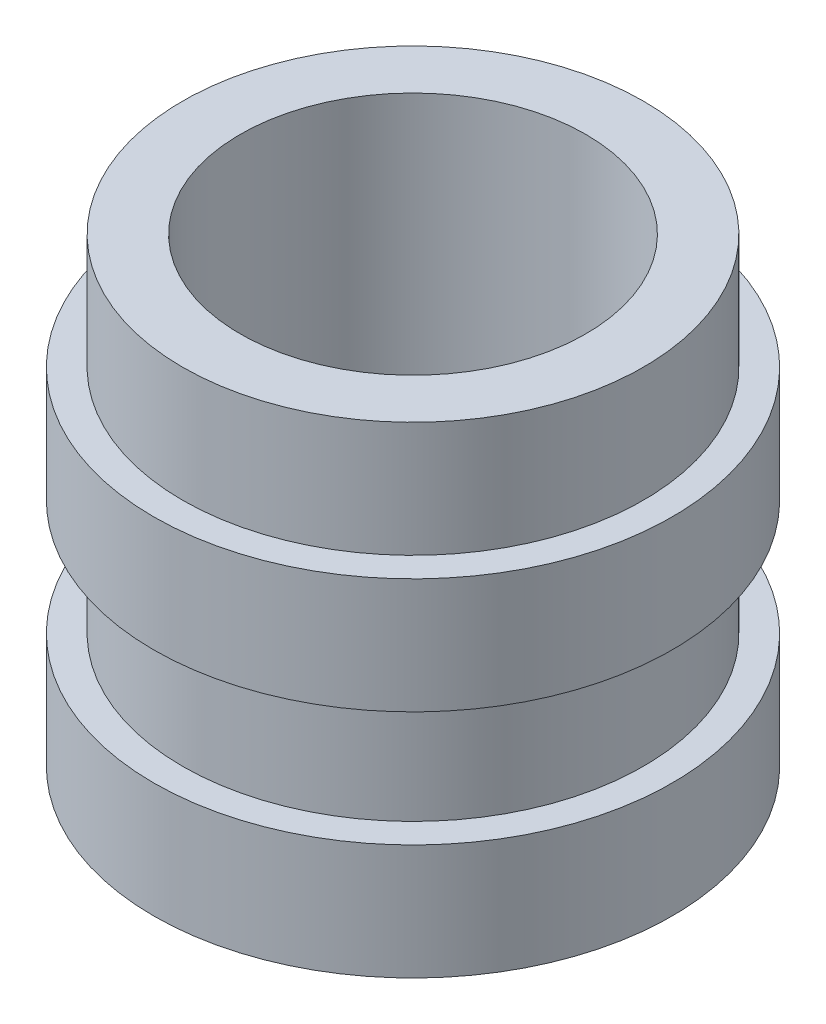
ISO-10303-21;
HEADER;
FILE_DESCRIPTION(('STEP AP214'),'2;1');
FILE_NAME('part.step','',(''),(''),'','','');
FILE_SCHEMA(('AUTOMOTIVE_DESIGN { 1 0 10303 214 1 1 1 1 }'));
ENDSEC;
DATA;
#1=APPLICATION_CONTEXT('core data for automotive mechanical design processes');
#2=APPLICATION_PROTOCOL_DEFINITION('international standard','automotive_design',2000,#1);
#3=PRODUCT_CONTEXT('',#1,'mechanical');
#4=PRODUCT('Part','Part','',(#3));
#5=PRODUCT_RELATED_PRODUCT_CATEGORY('part','',(#4));
#6=PRODUCT_DEFINITION_FORMATION('','',#4);
#7=PRODUCT_DEFINITION_CONTEXT('part definition',#1,'design');
#8=PRODUCT_DEFINITION('design','',#6,#7);
#9=PRODUCT_DEFINITION_SHAPE('','',#8);
#10=(LENGTH_UNIT() NAMED_UNIT(*) SI_UNIT(.MILLI.,.METRE.));
#11=(NAMED_UNIT(*) PLANE_ANGLE_UNIT() SI_UNIT($,.RADIAN.));
#12=(NAMED_UNIT(*) SI_UNIT($,.STERADIAN.) SOLID_ANGLE_UNIT());
#13=UNCERTAINTY_MEASURE_WITH_UNIT(LENGTH_MEASURE(1.E-05),#10,'distance_accuracy_value','');
#14=(GEOMETRIC_REPRESENTATION_CONTEXT(3) GLOBAL_UNCERTAINTY_ASSIGNED_CONTEXT((#13)) GLOBAL_UNIT_ASSIGNED_CONTEXT((#10,
#11,#12)) REPRESENTATION_CONTEXT('',''));
#15=CARTESIAN_POINT('',(0.,0.,0.));
#16=DIRECTION('',(0.,0.,1.));
#17=DIRECTION('',(1.,0.,0.));
#18=AXIS2_PLACEMENT_3D('',#15,#16,#17);
#19=CARTESIAN_POINT('',(0.,1.,0.));
#20=DIRECTION('',(0.,-1.,0.));
#21=DIRECTION('',(0.,0.,-1.));
#22=AXIS2_PLACEMENT_3D('',#19,#20,#21);
#23=CYLINDRICAL_SURFACE('',#22,2.);
#24=CARTESIAN_POINT('',(0.,1.,0.));
#25=DIRECTION('',(0.,1.,0.));
#26=DIRECTION('',(0.,0.,1.));
#27=AXIS2_PLACEMENT_3D('',#24,#25,#26);
#28=CIRCLE('',#27,2.);
#29=CARTESIAN_POINT('',(0.,1.,2.));
#30=VERTEX_POINT('',#29);
#31=EDGE_CURVE('E45',#30,#30,#28,.T.);
#32=ORIENTED_EDGE('',*,*,#31,.F.);
#33=EDGE_LOOP('',(#32));
#34=FACE_BOUND('',#33,.T.);
#35=CARTESIAN_POINT('',(0.,0.,0.));
#36=DIRECTION('',(0.,1.,0.));
#37=DIRECTION('',(0.,0.,1.));
#38=AXIS2_PLACEMENT_3D('',#35,#36,#37);
#39=CIRCLE('',#38,2.);
#40=CARTESIAN_POINT('',(0.,0.,2.));
#41=VERTEX_POINT('',#40);
#42=EDGE_CURVE('E40',#41,#41,#39,.T.);
#43=ORIENTED_EDGE('',*,*,#42,.T.);
#44=EDGE_LOOP('',(#43));
#45=FACE_BOUND('',#44,.T.);
#46=ADVANCED_FACE('F37',(#34,#45),#23,.T.);
#47=CARTESIAN_POINT('',(0.,1.,0.));
#48=DIRECTION('',(0.,1.,0.));
#49=DIRECTION('',(0.,0.,1.));
#50=AXIS2_PLACEMENT_3D('',#47,#48,#49);
#51=PLANE('',#50);
#52=CARTESIAN_POINT('',(0.,1.,0.));
#53=DIRECTION('',(0.,-1.,0.));
#54=DIRECTION('',(0.,0.,-1.));
#55=AXIS2_PLACEMENT_3D('',#52,#53,#54);
#56=CIRCLE('',#55,1.5);
#57=CARTESIAN_POINT('',(0.,1.,-1.5));
#58=VERTEX_POINT('',#57);
#59=EDGE_CURVE('E77',#58,#58,#56,.T.);
#60=ORIENTED_EDGE('',*,*,#59,.T.);
#61=EDGE_LOOP('',(#60));
#62=FACE_BOUND('',#61,.T.);
#63=ORIENTED_EDGE('',*,*,#31,.T.);
#64=EDGE_LOOP('',(#63));
#65=FACE_BOUND('',#64,.T.);
#66=ADVANCED_FACE('F87',(#62,#65),#51,.T.);
#67=CARTESIAN_POINT('',(0.,-1.,0.));
#68=DIRECTION('',(0.,1.,0.));
#69=DIRECTION('',(0.,0.,1.));
#70=AXIS2_PLACEMENT_3D('',#67,#68,#69);
#71=CYLINDRICAL_SURFACE('',#70,2.25);
#72=CARTESIAN_POINT('',(0.,-1.,0.));
#73=DIRECTION('',(0.,-1.,0.));
#74=DIRECTION('',(0.,0.,-1.));
#75=AXIS2_PLACEMENT_3D('',#72,#73,#74);
#76=CIRCLE('',#75,2.25);
#77=CARTESIAN_POINT('',(0.,-1.,-2.25));
#78=VERTEX_POINT('',#77);
#79=EDGE_CURVE('E55',#78,#78,#76,.T.);
#80=ORIENTED_EDGE('',*,*,#79,.F.);
#81=EDGE_LOOP('',(#80));
#82=FACE_BOUND('',#81,.T.);
#83=CARTESIAN_POINT('',(0.,0.,0.));
#84=DIRECTION('',(0.,-1.,0.));
#85=DIRECTION('',(0.,0.,-1.));
#86=AXIS2_PLACEMENT_3D('',#83,#84,#85);
#87=CIRCLE('',#86,2.25);
#88=CARTESIAN_POINT('',(0.,0.,-2.25));
#89=VERTEX_POINT('',#88);
#90=EDGE_CURVE('E59',#89,#89,#87,.T.);
#91=ORIENTED_EDGE('',*,*,#90,.T.);
#92=EDGE_LOOP('',(#91));
#93=FACE_BOUND('',#92,.T.);
#94=ADVANCED_FACE('F114',(#82,#93),#71,.T.);
#95=CARTESIAN_POINT('',(0.,-1.,0.));
#96=DIRECTION('',(0.,-1.,0.));
#97=DIRECTION('',(0.,0.,-1.));
#98=AXIS2_PLACEMENT_3D('',#95,#96,#97);
#99=PLANE('',#98);
#100=CARTESIAN_POINT('',(0.,-1.,0.));
#101=DIRECTION('',(0.,-1.,0.));
#102=DIRECTION('',(0.,0.,-1.));
#103=AXIS2_PLACEMENT_3D('',#100,#101,#102);
#104=CIRCLE('',#103,2.);
#105=CARTESIAN_POINT('',(0.,-1.,-2.));
#106=VERTEX_POINT('',#105);
#107=EDGE_CURVE('E10',#106,#106,#104,.T.);
#108=ORIENTED_EDGE('',*,*,#107,.F.);
#109=EDGE_LOOP('',(#108));
#110=FACE_BOUND('',#109,.T.);
#111=ORIENTED_EDGE('',*,*,#79,.T.);
#112=EDGE_LOOP('',(#111));
#113=FACE_BOUND('',#112,.T.);
#114=ADVANCED_FACE('F124',(#110,#113),#99,.T.);
#115=CARTESIAN_POINT('',(0.,0.,0.));
#116=DIRECTION('',(0.,-1.,0.));
#117=DIRECTION('',(0.,0.,-1.));
#118=AXIS2_PLACEMENT_3D('',#115,#116,#117);
#119=PLANE('',#118);
#120=ORIENTED_EDGE('',*,*,#42,.F.);
#121=EDGE_LOOP('',(#120));
#122=FACE_BOUND('',#121,.T.);
#123=ORIENTED_EDGE('',*,*,#90,.F.);
#124=EDGE_LOOP('',(#123));
#125=FACE_BOUND('',#124,.T.);
#126=ADVANCED_FACE('F121',(#122,#125),#119,.F.);
#127=CARTESIAN_POINT('',(0.,-2.,0.));
#128=DIRECTION('',(0.,1.,0.));
#129=DIRECTION('',(0.,0.,1.));
#130=AXIS2_PLACEMENT_3D('',#127,#128,#129);
#131=CYLINDRICAL_SURFACE('',#130,2.);
#132=CARTESIAN_POINT('',(0.,-2.,0.));
#133=DIRECTION('',(0.,-1.,0.));
#134=DIRECTION('',(0.,0.,-1.));
#135=AXIS2_PLACEMENT_3D('',#132,#133,#134);
#136=CIRCLE('',#135,2.);
#137=CARTESIAN_POINT('',(0.,-2.,-2.));
#138=VERTEX_POINT('',#137);
#139=EDGE_CURVE('E53',#138,#138,#136,.T.);
#140=ORIENTED_EDGE('',*,*,#139,.F.);
#141=EDGE_LOOP('',(#140));
#142=FACE_BOUND('',#141,.T.);
#143=ORIENTED_EDGE('',*,*,#107,.T.);
#144=EDGE_LOOP('',(#143));
#145=FACE_BOUND('',#144,.T.);
#146=ADVANCED_FACE('F106',(#142,#145),#131,.T.);
#147=CARTESIAN_POINT('',(0.,-3.,0.));
#148=DIRECTION('',(0.,1.,0.));
#149=DIRECTION('',(0.,0.,1.));
#150=AXIS2_PLACEMENT_3D('',#147,#148,#149);
#151=CYLINDRICAL_SURFACE('',#150,2.25);
#152=CARTESIAN_POINT('',(0.,-3.,0.));
#153=DIRECTION('',(0.,-1.,0.));
#154=DIRECTION('',(0.,0.,-1.));
#155=AXIS2_PLACEMENT_3D('',#152,#153,#154);
#156=CIRCLE('',#155,2.25);
#157=CARTESIAN_POINT('',(0.,-3.,-2.25));
#158=VERTEX_POINT('',#157);
#159=EDGE_CURVE('E66',#158,#158,#156,.T.);
#160=ORIENTED_EDGE('',*,*,#159,.F.);
#161=EDGE_LOOP('',(#160));
#162=FACE_BOUND('',#161,.T.);
#163=CARTESIAN_POINT('',(0.,-2.,0.));
#164=DIRECTION('',(0.,-1.,0.));
#165=DIRECTION('',(0.,0.,-1.));
#166=AXIS2_PLACEMENT_3D('',#163,#164,#165);
#167=CIRCLE('',#166,2.25);
#168=CARTESIAN_POINT('',(0.,-2.,-2.25));
#169=VERTEX_POINT('',#168);
#170=EDGE_CURVE('E71',#169,#169,#167,.T.);
#171=ORIENTED_EDGE('',*,*,#170,.T.);
#172=EDGE_LOOP('',(#171));
#173=FACE_BOUND('',#172,.T.);
#174=ADVANCED_FACE('F99',(#162,#173),#151,.T.);
#175=CARTESIAN_POINT('',(0.,-3.,0.));
#176=DIRECTION('',(0.,-1.,0.));
#177=DIRECTION('',(0.,0.,-1.));
#178=AXIS2_PLACEMENT_3D('',#175,#176,#177);
#179=PLANE('',#178);
#180=CARTESIAN_POINT('',(0.,-3.,0.));
#181=DIRECTION('',(0.,-1.,0.));
#182=DIRECTION('',(0.,0.,-1.));
#183=AXIS2_PLACEMENT_3D('',#180,#181,#182);
#184=CIRCLE('',#183,1.5);
#185=CARTESIAN_POINT('',(0.,-3.,-1.5));
#186=VERTEX_POINT('',#185);
#187=EDGE_CURVE('E79',#186,#186,#184,.T.);
#188=ORIENTED_EDGE('',*,*,#187,.F.);
#189=EDGE_LOOP('',(#188));
#190=FACE_BOUND('',#189,.T.);
#191=ORIENTED_EDGE('',*,*,#159,.T.);
#192=EDGE_LOOP('',(#191));
#193=FACE_BOUND('',#192,.T.);
#194=ADVANCED_FACE('F97',(#190,#193),#179,.T.);
#195=CARTESIAN_POINT('',(0.,-2.,0.));
#196=DIRECTION('',(0.,-1.,0.));
#197=DIRECTION('',(0.,0.,-1.));
#198=AXIS2_PLACEMENT_3D('',#195,#196,#197);
#199=PLANE('',#198);
#200=ORIENTED_EDGE('',*,*,#139,.T.);
#201=EDGE_LOOP('',(#200));
#202=FACE_BOUND('',#201,.T.);
#203=ORIENTED_EDGE('',*,*,#170,.F.);
#204=EDGE_LOOP('',(#203));
#205=FACE_BOUND('',#204,.T.);
#206=ADVANCED_FACE('F93',(#202,#205),#199,.F.);
#207=CARTESIAN_POINT('',(0.,1.,0.));
#208=DIRECTION('',(0.,-1.,0.));
#209=DIRECTION('',(0.,0.,-1.));
#210=AXIS2_PLACEMENT_3D('',#207,#208,#209);
#211=CYLINDRICAL_SURFACE('',#210,1.5);
#212=ORIENTED_EDGE('',*,*,#59,.F.);
#213=EDGE_LOOP('',(#212));
#214=FACE_BOUND('',#213,.T.);
#215=ORIENTED_EDGE('',*,*,#187,.T.);
#216=EDGE_LOOP('',(#215));
#217=FACE_BOUND('',#216,.T.);
#218=ADVANCED_FACE('F90',(#214,#217),#211,.F.);
#219=CLOSED_SHELL('',(#46,#66,#94,#114,#126,#146,#174,#194,#206,#218));
#220=MANIFOLD_SOLID_BREP('B2',#219);
#221=ADVANCED_BREP_SHAPE_REPRESENTATION('',(#18,#220),#14);
#222=SHAPE_DEFINITION_REPRESENTATION(#9,#221);
ENDSEC;
END-ISO-10303-21;
